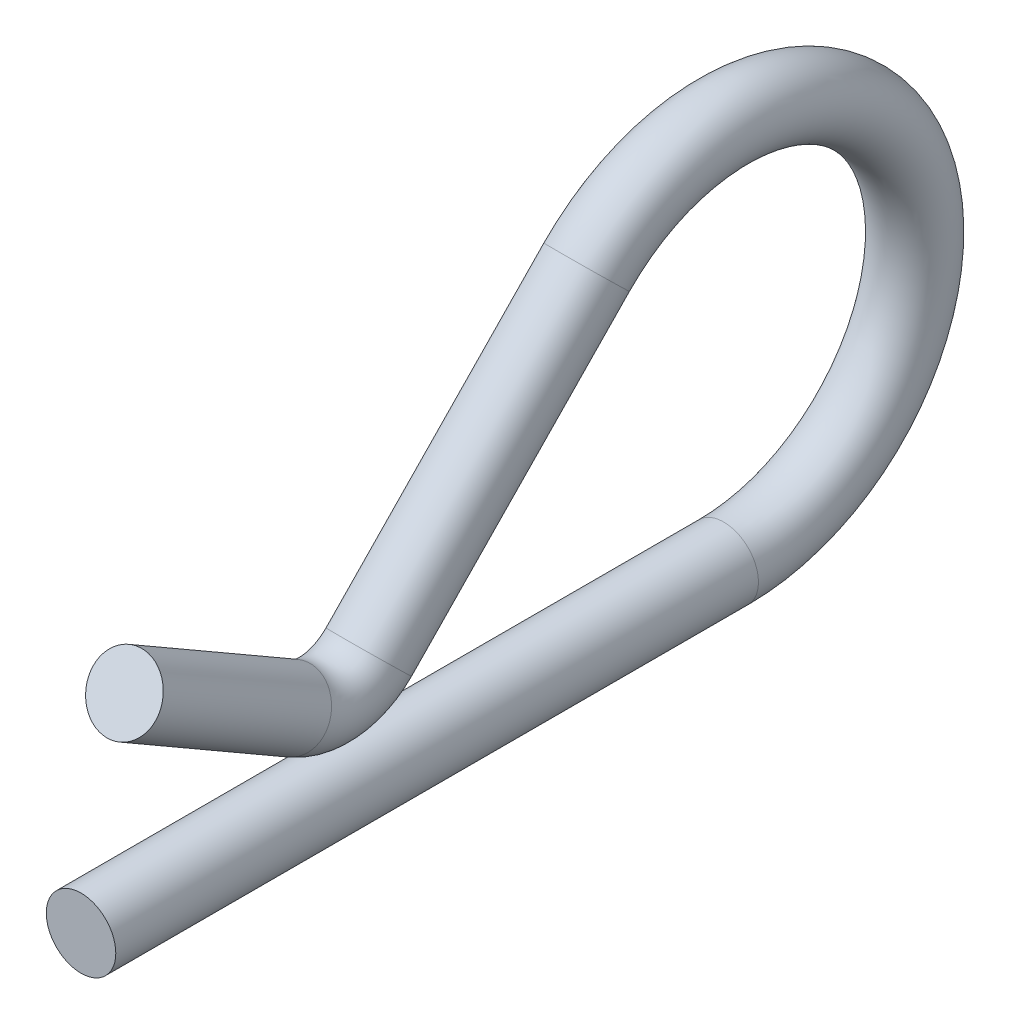
ISO-10303-21;
HEADER;
FILE_DESCRIPTION(('STEP AP214'),'2;1');
FILE_NAME('part.step','',(''),(''),'','','');
FILE_SCHEMA(('AUTOMOTIVE_DESIGN { 1 0 10303 214 1 1 1 1 }'));
ENDSEC;
DATA;
#1=APPLICATION_CONTEXT('core data for automotive mechanical design processes');
#2=APPLICATION_PROTOCOL_DEFINITION('international standard','automotive_design',2000,#1);
#3=PRODUCT_CONTEXT('',#1,'mechanical');
#4=PRODUCT('Part','Part','',(#3));
#5=PRODUCT_RELATED_PRODUCT_CATEGORY('part','',(#4));
#6=PRODUCT_DEFINITION_FORMATION('','',#4);
#7=PRODUCT_DEFINITION_CONTEXT('part definition',#1,'design');
#8=PRODUCT_DEFINITION('design','',#6,#7);
#9=PRODUCT_DEFINITION_SHAPE('','',#8);
#10=(LENGTH_UNIT() NAMED_UNIT(*) SI_UNIT(.MILLI.,.METRE.));
#11=(NAMED_UNIT(*) PLANE_ANGLE_UNIT() SI_UNIT($,.RADIAN.));
#12=(NAMED_UNIT(*) SI_UNIT($,.STERADIAN.) SOLID_ANGLE_UNIT());
#13=UNCERTAINTY_MEASURE_WITH_UNIT(LENGTH_MEASURE(1.E-05),#10,'distance_accuracy_value','');
#14=(GEOMETRIC_REPRESENTATION_CONTEXT(3) GLOBAL_UNCERTAINTY_ASSIGNED_CONTEXT((#13)) GLOBAL_UNIT_ASSIGNED_CONTEXT((#10,
#11,#12)) REPRESENTATION_CONTEXT('',''));
#15=CARTESIAN_POINT('',(0.,0.,0.));
#16=DIRECTION('',(0.,0.,1.));
#17=DIRECTION('',(1.,0.,0.));
#18=AXIS2_PLACEMENT_3D('',#15,#16,#17);
#19=CARTESIAN_POINT('',(0.,0.,29.3624));
#20=DIRECTION('',(0.,0.,1.));
#21=DIRECTION('',(1.,0.,0.));
#22=AXIS2_PLACEMENT_3D('',#19,#20,#21);
#23=PLANE('',#22);
#24=CARTESIAN_POINT('',(0.,0.,29.3624));
#25=DIRECTION('',(0.,0.,1.));
#26=DIRECTION('',(1.,0.,0.));
#27=AXIS2_PLACEMENT_3D('',#24,#25,#26);
#28=CIRCLE('',#27,1.5875);
#29=CARTESIAN_POINT('',(1.5875,0.,29.3624));
#30=VERTEX_POINT('',#29);
#31=EDGE_CURVE('E56',#30,#30,#28,.T.);
#32=ORIENTED_EDGE('',*,*,#31,.T.);
#33=EDGE_LOOP('',(#32));
#34=FACE_BOUND('',#33,.T.);
#35=ADVANCED_FACE('F43',(#34),#23,.T.);
#36=CARTESIAN_POINT('',(0.,8.50306293119374,27.3802448666878));
#37=DIRECTION('',(0.,-0.499801658779357,-0.86613988586221));
#38=DIRECTION('',(1.,0.,0.));
#39=AXIS2_PLACEMENT_3D('',#36,#37,#38);
#40=PLANE('',#39);
#41=CARTESIAN_POINT('',(0.,8.50306293119374,27.3802448666878));
#42=DIRECTION('',(0.,-0.499801658779357,-0.86613988586221));
#43=DIRECTION('',(1.,0.,0.));
#44=AXIS2_PLACEMENT_3D('',#41,#42,#43);
#45=CIRCLE('',#44,1.5875);
#46=CARTESIAN_POINT('',(1.5875,8.50306293119374,27.3802448666878));
#47=VERTEX_POINT('',#46);
#48=EDGE_CURVE('E11',#47,#47,#45,.T.);
#49=ORIENTED_EDGE('',*,*,#48,.F.);
#50=EDGE_LOOP('',(#49));
#51=FACE_BOUND('',#50,.T.);
#52=ADVANCED_FACE('F62',(#51),#40,.F.);
#53=CARTESIAN_POINT('',(0.,0.,29.3624));
#54=DIRECTION('',(0.,0.,-1.));
#55=DIRECTION('',(0.,1.,0.));
#56=AXIS2_PLACEMENT_3D('',#53,#54,#55);
#57=CYLINDRICAL_SURFACE('',#56,1.5875);
#58=CARTESIAN_POINT('',(0.,0.,0.));
#59=DIRECTION('',(0.,0.,1.));
#60=DIRECTION('',(1.,0.,0.));
#61=AXIS2_PLACEMENT_3D('',#58,#59,#60);
#62=CIRCLE('',#61,1.5875);
#63=CARTESIAN_POINT('',(0.,-1.58750000000001,0.));
#64=VERTEX_POINT('',#63);
#65=EDGE_CURVE('E96',#64,#64,#62,.T.);
#66=ORIENTED_EDGE('',*,*,#65,.T.);
#67=EDGE_LOOP('',(#66));
#68=FACE_BOUND('',#67,.T.);
#69=ORIENTED_EDGE('',*,*,#31,.F.);
#70=EDGE_LOOP('',(#69));
#71=FACE_BOUND('',#70,.T.);
#72=ADVANCED_FACE('F64',(#68,#71),#57,.T.);
#73=CARTESIAN_POINT('',(0.,8.7249,0.));
#74=DIRECTION('',(1.,0.,0.));
#75=DIRECTION('',(0.,0.,-1.));
#76=AXIS2_PLACEMENT_3D('',#73,#74,#75);
#77=TOROIDAL_SURFACE('',#76,8.72490000000001,1.5875);
#78=CARTESIAN_POINT('',(0.,14.8024013537099,6.26002055153605));
#79=DIRECTION('',(0.,0.717489088876211,-0.696569743344904));
#80=DIRECTION('',(1.,0.,0.));
#81=AXIS2_PLACEMENT_3D('',#78,#79,#80);
#82=CIRCLE('',#81,1.5875);
#83=CARTESIAN_POINT('',(0.,15.90820582127,7.39903448012704));
#84=VERTEX_POINT('',#83);
#85=EDGE_CURVE('E93',#84,#84,#82,.T.);
#86=CARTESIAN_POINT('',(0.,8.7249,0.));
#87=DIRECTION('',(1.,0.,0.));
#88=DIRECTION('',(0.,0.,-1.));
#89=AXIS2_PLACEMENT_3D('',#86,#87,#88);
#90=CIRCLE('',#89,10.3124);
#91=EDGE_CURVE('',#64,#84,#90,.T.);
#92=ORIENTED_EDGE('',*,*,#65,.F.);
#93=ORIENTED_EDGE('',*,*,#85,.T.);
#94=ORIENTED_EDGE('',*,*,#91,.T.);
#95=ORIENTED_EDGE('',*,*,#91,.F.);
#96=EDGE_LOOP('',(#92,#94,#93,#95));
#97=FACE_BOUND('',#96,.T.);
#98=ADVANCED_FACE('F69',(#97),#77,.T.);
#99=CARTESIAN_POINT('',(0.,14.8024013537099,6.26002055153605));
#100=DIRECTION('',(0.,-0.717489088876212,0.696569743344903));
#101=DIRECTION('',(0.,-0.696569743344903,-0.717489088876212));
#102=AXIS2_PLACEMENT_3D('',#99,#100,#101);
#103=CYLINDRICAL_SURFACE('',#102,1.5875);
#104=CARTESIAN_POINT('',(0.,4.54928124554004,16.214197350822));
#105=DIRECTION('',(0.,0.717489088876212,-0.696569743344903));
#106=DIRECTION('',(1.,0.,0.));
#107=AXIS2_PLACEMENT_3D('',#104,#105,#106);
#108=CIRCLE('',#107,1.5875);
#109=CARTESIAN_POINT('',(0.,3.44347677798001,15.075183422231));
#110=VERTEX_POINT('',#109);
#111=EDGE_CURVE('E102',#110,#110,#108,.T.);
#112=ORIENTED_EDGE('',*,*,#111,.T.);
#113=EDGE_LOOP('',(#112));
#114=FACE_BOUND('',#113,.T.);
#115=ORIENTED_EDGE('',*,*,#85,.F.);
#116=EDGE_LOOP('',(#115));
#117=FACE_BOUND('',#116,.T.);
#118=ADVANCED_FACE('F79',(#114,#117),#103,.T.);
#119=CARTESIAN_POINT('',(0.,6.53796,18.2626));
#120=DIRECTION('',(-1.,0.,0.));
#121=DIRECTION('',(0.,0.,1.));
#122=AXIS2_PLACEMENT_3D('',#119,#120,#121);
#123=TOROIDAL_SURFACE('',#122,2.85496,1.5875);
#124=CARTESIAN_POINT('',(0.,4.06516527145882,19.6895137437487));
#125=DIRECTION('',(0.,-0.499801658779357,-0.86613988586221));
#126=DIRECTION('',(1.,0.,0.));
#127=AXIS2_PLACEMENT_3D('',#124,#125,#126);
#128=CIRCLE('',#127,1.5875);
#129=CARTESIAN_POINT('',(0.,2.69016820265257,20.4829488770609));
#130=VERTEX_POINT('',#129);
#131=EDGE_CURVE('E51',#130,#130,#128,.T.);
#132=CARTESIAN_POINT('',(0.,6.53796,18.2626));
#133=DIRECTION('',(-1.,0.,0.));
#134=DIRECTION('',(0.,0.,1.));
#135=AXIS2_PLACEMENT_3D('',#132,#133,#134);
#136=CIRCLE('',#135,4.44246);
#137=EDGE_CURVE('',#110,#130,#136,.T.);
#138=ORIENTED_EDGE('',*,*,#111,.F.);
#139=ORIENTED_EDGE('',*,*,#131,.T.);
#140=ORIENTED_EDGE('',*,*,#137,.T.);
#141=ORIENTED_EDGE('',*,*,#137,.F.);
#142=EDGE_LOOP('',(#138,#140,#139,#141));
#143=FACE_BOUND('',#142,.T.);
#144=ADVANCED_FACE('F75',(#143),#123,.T.);
#145=CARTESIAN_POINT('',(0.,4.06516527145882,19.6895137437487));
#146=DIRECTION('',(0.,0.499801658779357,0.86613988586221));
#147=DIRECTION('',(0.,-0.86613988586221,0.499801658779358));
#148=AXIS2_PLACEMENT_3D('',#145,#146,#147);
#149=CYLINDRICAL_SURFACE('',#148,1.5875);
#150=ORIENTED_EDGE('',*,*,#48,.T.);
#151=EDGE_LOOP('',(#150));
#152=FACE_BOUND('',#151,.T.);
#153=ORIENTED_EDGE('',*,*,#131,.F.);
#154=EDGE_LOOP('',(#153));
#155=FACE_BOUND('',#154,.T.);
#156=ADVANCED_FACE('F59',(#152,#155),#149,.T.);
#157=CLOSED_SHELL('',(#35,#52,#72,#98,#118,#144,#156));
#158=MANIFOLD_SOLID_BREP('B2',#157);
#159=ADVANCED_BREP_SHAPE_REPRESENTATION('',(#18,#158),#14);
#160=SHAPE_DEFINITION_REPRESENTATION(#9,#159);
ENDSEC;
END-ISO-10303-21;
